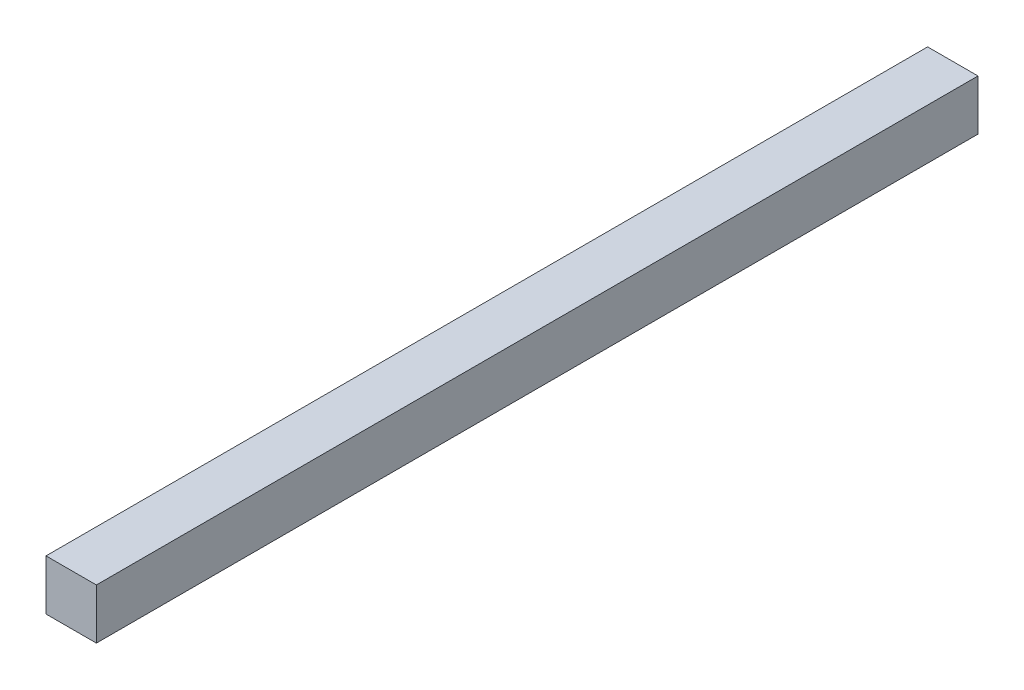
ISO-10303-21;
HEADER;
FILE_DESCRIPTION(('STEP AP214'),'2;1');
FILE_NAME('part.step','',(''),(''),'','','');
FILE_SCHEMA(('AUTOMOTIVE_DESIGN { 1 0 10303 214 1 1 1 1 }'));
ENDSEC;
DATA;
#1=APPLICATION_CONTEXT('core data for automotive mechanical design processes');
#2=APPLICATION_PROTOCOL_DEFINITION('international standard','automotive_design',2000,#1);
#3=PRODUCT_CONTEXT('',#1,'mechanical');
#4=PRODUCT('Part','Part','',(#3));
#5=PRODUCT_RELATED_PRODUCT_CATEGORY('part','',(#4));
#6=PRODUCT_DEFINITION_FORMATION('','',#4);
#7=PRODUCT_DEFINITION_CONTEXT('part definition',#1,'design');
#8=PRODUCT_DEFINITION('design','',#6,#7);
#9=PRODUCT_DEFINITION_SHAPE('','',#8);
#10=(LENGTH_UNIT() NAMED_UNIT(*) SI_UNIT(.MILLI.,.METRE.));
#11=(NAMED_UNIT(*) PLANE_ANGLE_UNIT() SI_UNIT($,.RADIAN.));
#12=(NAMED_UNIT(*) SI_UNIT($,.STERADIAN.) SOLID_ANGLE_UNIT());
#13=UNCERTAINTY_MEASURE_WITH_UNIT(LENGTH_MEASURE(1.E-05),#10,'distance_accuracy_value','');
#14=(GEOMETRIC_REPRESENTATION_CONTEXT(3) GLOBAL_UNCERTAINTY_ASSIGNED_CONTEXT((#13)) GLOBAL_UNIT_ASSIGNED_CONTEXT((#10,
#11,#12)) REPRESENTATION_CONTEXT('',''));
#15=CARTESIAN_POINT('',(0.,0.,0.));
#16=DIRECTION('',(0.,0.,1.));
#17=DIRECTION('',(1.,0.,0.));
#18=AXIS2_PLACEMENT_3D('',#15,#16,#17);
#19=CARTESIAN_POINT('',(-10.,10.,350.));
#20=DIRECTION('',(1.,0.,0.));
#21=DIRECTION('',(0.,1.,0.));
#22=AXIS2_PLACEMENT_3D('',#19,#20,#21);
#23=PLANE('',#22);
#24=DIRECTION('',(0.,-1.,0.));
#25=VECTOR('',#24,1.);
#26=CARTESIAN_POINT('',(-10.,10.,0.));
#27=LINE('',#26,#25);
#28=CARTESIAN_POINT('',(-10.,10.,0.));
#29=VERTEX_POINT('',#28);
#30=CARTESIAN_POINT('',(-10.,-10.,0.));
#31=VERTEX_POINT('',#30);
#32=EDGE_CURVE('E96',#29,#31,#27,.T.);
#33=ORIENTED_EDGE('',*,*,#32,.T.);
#34=DIRECTION('',(0.,0.,-1.));
#35=VECTOR('',#34,1.);
#36=CARTESIAN_POINT('',(-10.,-10.,350.));
#37=LINE('',#36,#35);
#38=CARTESIAN_POINT('',(-10.,-10.,350.));
#39=VERTEX_POINT('',#38);
#40=EDGE_CURVE('E11',#39,#31,#37,.T.);
#41=ORIENTED_EDGE('',*,*,#40,.F.);
#42=DIRECTION('',(0.,-1.,0.));
#43=VECTOR('',#42,1.);
#44=CARTESIAN_POINT('',(-10.,10.,350.));
#45=LINE('',#44,#43);
#46=CARTESIAN_POINT('',(-10.,10.,350.));
#47=VERTEX_POINT('',#46);
#48=EDGE_CURVE('E84',#47,#39,#45,.T.);
#49=ORIENTED_EDGE('',*,*,#48,.F.);
#50=DIRECTION('',(0.,0.,-1.));
#51=VECTOR('',#50,1.);
#52=CARTESIAN_POINT('',(-10.,10.,350.));
#53=LINE('',#52,#51);
#54=EDGE_CURVE('E92',#47,#29,#53,.T.);
#55=ORIENTED_EDGE('',*,*,#54,.T.);
#56=EDGE_LOOP('',(#33,#41,#49,#55));
#57=FACE_BOUND('',#56,.T.);
#58=ADVANCED_FACE('F33',(#57),#23,.F.);
#59=CARTESIAN_POINT('',(-10.,-10.,350.));
#60=DIRECTION('',(0.,1.,0.));
#61=DIRECTION('',(0.,0.,1.));
#62=AXIS2_PLACEMENT_3D('',#59,#60,#61);
#63=PLANE('',#62);
#64=DIRECTION('',(1.,0.,0.));
#65=VECTOR('',#64,1.);
#66=CARTESIAN_POINT('',(-10.,-10.,0.));
#67=LINE('',#66,#65);
#68=CARTESIAN_POINT('',(10.,-10.,0.));
#69=VERTEX_POINT('',#68);
#70=EDGE_CURVE('E88',#31,#69,#67,.T.);
#71=ORIENTED_EDGE('',*,*,#70,.T.);
#72=DIRECTION('',(0.,0.,-1.));
#73=VECTOR('',#72,1.);
#74=CARTESIAN_POINT('',(10.,-10.,350.));
#75=LINE('',#74,#73);
#76=CARTESIAN_POINT('',(10.,-10.,350.));
#77=VERTEX_POINT('',#76);
#78=EDGE_CURVE('E41',#77,#69,#75,.T.);
#79=ORIENTED_EDGE('',*,*,#78,.F.);
#80=DIRECTION('',(1.,0.,0.));
#81=VECTOR('',#80,1.);
#82=CARTESIAN_POINT('',(-10.,-10.,350.));
#83=LINE('',#82,#81);
#84=EDGE_CURVE('E79',#39,#77,#83,.T.);
#85=ORIENTED_EDGE('',*,*,#84,.F.);
#86=ORIENTED_EDGE('',*,*,#40,.T.);
#87=EDGE_LOOP('',(#71,#79,#85,#86));
#88=FACE_BOUND('',#87,.T.);
#89=ADVANCED_FACE('F87',(#88),#63,.F.);
#90=CARTESIAN_POINT('',(10.,10.,350.));
#91=DIRECTION('',(-1.,0.,0.));
#92=DIRECTION('',(0.,-1.,0.));
#93=AXIS2_PLACEMENT_3D('',#90,#91,#92);
#94=PLANE('',#93);
#95=DIRECTION('',(0.,1.,0.));
#96=VECTOR('',#95,1.);
#97=CARTESIAN_POINT('',(10.,10.,0.));
#98=LINE('',#97,#96);
#99=CARTESIAN_POINT('',(10.,10.,0.));
#100=VERTEX_POINT('',#99);
#101=EDGE_CURVE('E66',#69,#100,#98,.T.);
#102=ORIENTED_EDGE('',*,*,#101,.T.);
#103=DIRECTION('',(0.,0.,-1.));
#104=VECTOR('',#103,1.);
#105=CARTESIAN_POINT('',(10.,10.,350.));
#106=LINE('',#105,#104);
#107=CARTESIAN_POINT('',(10.,10.,350.));
#108=VERTEX_POINT('',#107);
#109=EDGE_CURVE('E89',#108,#100,#106,.T.);
#110=ORIENTED_EDGE('',*,*,#109,.F.);
#111=DIRECTION('',(0.,1.,0.));
#112=VECTOR('',#111,1.);
#113=CARTESIAN_POINT('',(10.,10.,350.));
#114=LINE('',#113,#112);
#115=EDGE_CURVE('E82',#77,#108,#114,.T.);
#116=ORIENTED_EDGE('',*,*,#115,.F.);
#117=ORIENTED_EDGE('',*,*,#78,.T.);
#118=EDGE_LOOP('',(#102,#110,#116,#117));
#119=FACE_BOUND('',#118,.T.);
#120=ADVANCED_FACE('F90',(#119),#94,.F.);
#121=CARTESIAN_POINT('',(-10.,10.,350.));
#122=DIRECTION('',(0.,-1.,0.));
#123=DIRECTION('',(0.,0.,-1.));
#124=AXIS2_PLACEMENT_3D('',#121,#122,#123);
#125=PLANE('',#124);
#126=DIRECTION('',(-1.,0.,0.));
#127=VECTOR('',#126,1.);
#128=CARTESIAN_POINT('',(-10.,10.,0.));
#129=LINE('',#128,#127);
#130=EDGE_CURVE('E72',#100,#29,#129,.T.);
#131=ORIENTED_EDGE('',*,*,#130,.T.);
#132=ORIENTED_EDGE('',*,*,#54,.F.);
#133=DIRECTION('',(-1.,0.,0.));
#134=VECTOR('',#133,1.);
#135=CARTESIAN_POINT('',(-10.,10.,350.));
#136=LINE('',#135,#134);
#137=EDGE_CURVE('E49',#108,#47,#136,.T.);
#138=ORIENTED_EDGE('',*,*,#137,.F.);
#139=ORIENTED_EDGE('',*,*,#109,.T.);
#140=EDGE_LOOP('',(#131,#132,#138,#139));
#141=FACE_BOUND('',#140,.T.);
#142=ADVANCED_FACE('F103',(#141),#125,.F.);
#143=CARTESIAN_POINT('',(0.,0.,350.));
#144=DIRECTION('',(0.,0.,1.));
#145=DIRECTION('',(1.,0.,0.));
#146=AXIS2_PLACEMENT_3D('',#143,#144,#145);
#147=PLANE('',#146);
#148=ORIENTED_EDGE('',*,*,#48,.T.);
#149=ORIENTED_EDGE('',*,*,#84,.T.);
#150=ORIENTED_EDGE('',*,*,#115,.T.);
#151=ORIENTED_EDGE('',*,*,#137,.T.);
#152=EDGE_LOOP('',(#148,#149,#150,#151));
#153=FACE_BOUND('',#152,.T.);
#154=ADVANCED_FACE('F80',(#153),#147,.T.);
#155=CARTESIAN_POINT('',(0.,0.,0.));
#156=DIRECTION('',(0.,0.,1.));
#157=DIRECTION('',(1.,0.,0.));
#158=AXIS2_PLACEMENT_3D('',#155,#156,#157);
#159=PLANE('',#158);
#160=ORIENTED_EDGE('',*,*,#32,.F.);
#161=ORIENTED_EDGE('',*,*,#130,.F.);
#162=ORIENTED_EDGE('',*,*,#101,.F.);
#163=ORIENTED_EDGE('',*,*,#70,.F.);
#164=EDGE_LOOP('',(#160,#161,#162,#163));
#165=FACE_BOUND('',#164,.T.);
#166=ADVANCED_FACE('F106',(#165),#159,.F.);
#167=CLOSED_SHELL('',(#58,#89,#120,#142,#154,#166));
#168=MANIFOLD_SOLID_BREP('B2',#167);
#169=ADVANCED_BREP_SHAPE_REPRESENTATION('',(#18,#168),#14);
#170=SHAPE_DEFINITION_REPRESENTATION(#9,#169);
ENDSEC;
END-ISO-10303-21;
